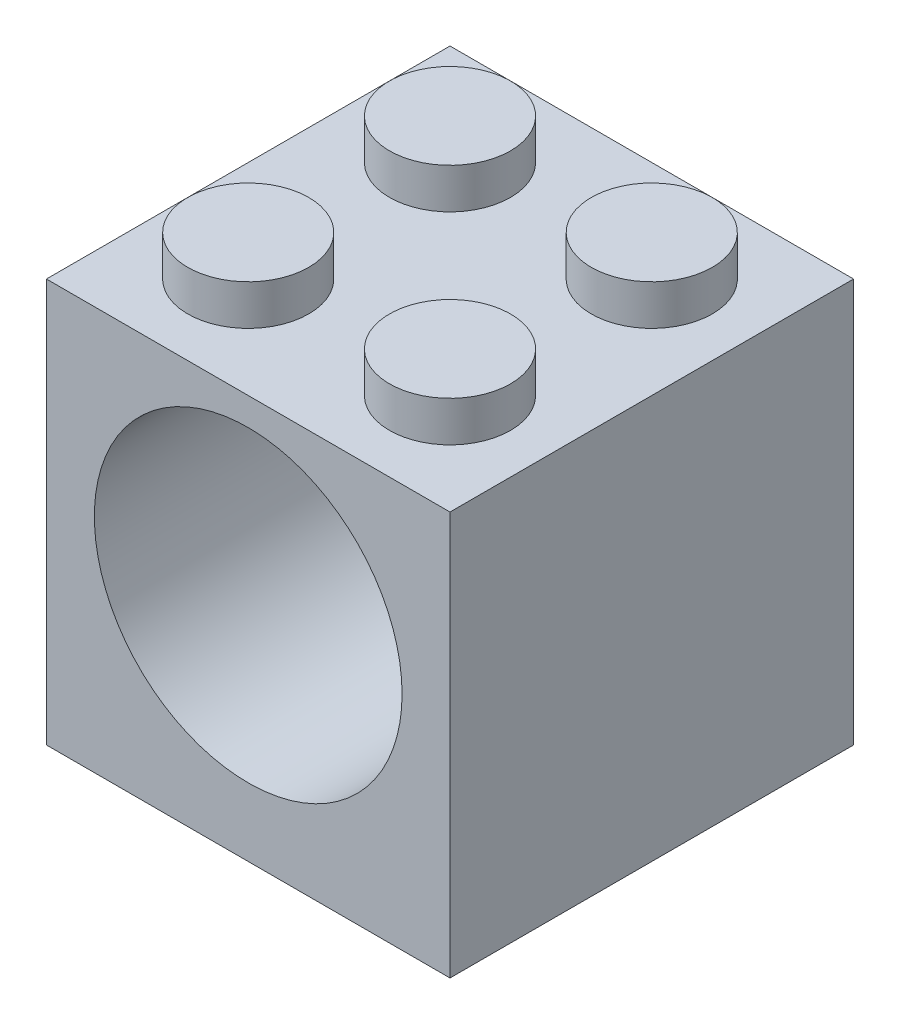
ISO-10303-21;
HEADER;
FILE_DESCRIPTION(('STEP AP214'),'2;1');
FILE_NAME('part.step','',(''),(''),'','','');
FILE_SCHEMA(('AUTOMOTIVE_DESIGN { 1 0 10303 214 1 1 1 1 }'));
ENDSEC;
DATA;
#1=APPLICATION_CONTEXT('core data for automotive mechanical design processes');
#2=APPLICATION_PROTOCOL_DEFINITION('international standard','automotive_design',2000,#1);
#3=PRODUCT_CONTEXT('',#1,'mechanical');
#4=PRODUCT('Part','Part','',(#3));
#5=PRODUCT_RELATED_PRODUCT_CATEGORY('part','',(#4));
#6=PRODUCT_DEFINITION_FORMATION('','',#4);
#7=PRODUCT_DEFINITION_CONTEXT('part definition',#1,'design');
#8=PRODUCT_DEFINITION('design','',#6,#7);
#9=PRODUCT_DEFINITION_SHAPE('','',#8);
#10=(LENGTH_UNIT() NAMED_UNIT(*) SI_UNIT(.MILLI.,.METRE.));
#11=(NAMED_UNIT(*) PLANE_ANGLE_UNIT() SI_UNIT($,.RADIAN.));
#12=(NAMED_UNIT(*) SI_UNIT($,.STERADIAN.) SOLID_ANGLE_UNIT());
#13=UNCERTAINTY_MEASURE_WITH_UNIT(LENGTH_MEASURE(1.E-05),#10,'distance_accuracy_value','');
#14=(GEOMETRIC_REPRESENTATION_CONTEXT(3) GLOBAL_UNCERTAINTY_ASSIGNED_CONTEXT((#13)) GLOBAL_UNIT_ASSIGNED_CONTEXT((#10,
#11,#12)) REPRESENTATION_CONTEXT('',''));
#15=CARTESIAN_POINT('',(0.,0.,0.));
#16=DIRECTION('',(0.,0.,1.));
#17=DIRECTION('',(1.,0.,0.));
#18=AXIS2_PLACEMENT_3D('',#15,#16,#17);
#19=CARTESIAN_POINT('',(12.,4.8,4.));
#20=DIRECTION('',(-1.,0.,0.));
#21=DIRECTION('',(0.,0.,1.));
#22=AXIS2_PLACEMENT_3D('',#19,#20,#21);
#23=PLANE('',#22);
#24=DIRECTION('',(0.,1.,0.));
#25=VECTOR('',#24,1.);
#26=CARTESIAN_POINT('',(12.,4.8,12.));
#27=LINE('',#26,#25);
#28=CARTESIAN_POINT('',(12.,-6.4,12.));
#29=VERTEX_POINT('',#28);
#30=CARTESIAN_POINT('',(12.,9.6,12.));
#31=VERTEX_POINT('',#30);
#32=EDGE_CURVE('E85',#29,#31,#27,.T.);
#33=ORIENTED_EDGE('',*,*,#32,.F.);
#34=DIRECTION('',(0.,0.,1.));
#35=VECTOR('',#34,1.);
#36=CARTESIAN_POINT('',(12.,-6.4,4.));
#37=LINE('',#36,#35);
#38=CARTESIAN_POINT('',(12.,-6.4,-4.));
#39=VERTEX_POINT('',#38);
#40=EDGE_CURVE('E116',#39,#29,#37,.T.);
#41=ORIENTED_EDGE('',*,*,#40,.F.);
#42=DIRECTION('',(0.,-1.,0.));
#43=VECTOR('',#42,1.);
#44=CARTESIAN_POINT('',(12.,4.8,-4.));
#45=LINE('',#44,#43);
#46=CARTESIAN_POINT('',(12.,9.6,-4.));
#47=VERTEX_POINT('',#46);
#48=EDGE_CURVE('E45',#47,#39,#45,.T.);
#49=ORIENTED_EDGE('',*,*,#48,.F.);
#50=DIRECTION('',(0.,0.,-1.));
#51=VECTOR('',#50,1.);
#52=CARTESIAN_POINT('',(12.,9.6,4.));
#53=LINE('',#52,#51);
#54=EDGE_CURVE('E11',#31,#47,#53,.T.);
#55=ORIENTED_EDGE('',*,*,#54,.F.);
#56=EDGE_LOOP('',(#33,#41,#49,#55));
#57=FACE_BOUND('',#56,.T.);
#58=ADVANCED_FACE('F41',(#57),#23,.F.);
#59=CARTESIAN_POINT('',(4.,9.6,4.));
#60=DIRECTION('',(0.,-1.,0.));
#61=DIRECTION('',(0.,0.,-1.));
#62=AXIS2_PLACEMENT_3D('',#59,#60,#61);
#63=PLANE('',#62);
#64=ORIENTED_EDGE('',*,*,#54,.T.);
#65=DIRECTION('',(1.,0.,0.));
#66=VECTOR('',#65,1.);
#67=CARTESIAN_POINT('',(4.,9.6,-4.));
#68=LINE('',#67,#66);
#69=CARTESIAN_POINT('',(-4.,9.6,-4.));
#70=VERTEX_POINT('',#69);
#71=EDGE_CURVE('E121',#70,#47,#68,.T.);
#72=ORIENTED_EDGE('',*,*,#71,.F.);
#73=DIRECTION('',(0.,0.,-1.));
#74=VECTOR('',#73,1.);
#75=CARTESIAN_POINT('',(-4.,9.6,4.));
#76=LINE('',#75,#74);
#77=CARTESIAN_POINT('',(-4.,9.6,12.));
#78=VERTEX_POINT('',#77);
#79=EDGE_CURVE('E51',#78,#70,#76,.T.);
#80=ORIENTED_EDGE('',*,*,#79,.F.);
#81=DIRECTION('',(-1.,0.,0.));
#82=VECTOR('',#81,1.);
#83=CARTESIAN_POINT('',(4.,9.6,12.));
#84=LINE('',#83,#82);
#85=EDGE_CURVE('E100',#31,#78,#84,.T.);
#86=ORIENTED_EDGE('',*,*,#85,.F.);
#87=EDGE_LOOP('',(#64,#72,#80,#86));
#88=FACE_BOUND('',#87,.T.);
#89=CARTESIAN_POINT('',(0.,9.6,0.));
#90=DIRECTION('',(0.,-1.,0.));
#91=DIRECTION('',(1.,0.,0.));
#92=AXIS2_PLACEMENT_3D('',#89,#90,#91);
#93=CIRCLE('',#92,2.4);
#94=CARTESIAN_POINT('',(2.4,9.6,0.));
#95=VERTEX_POINT('',#94);
#96=EDGE_CURVE('E110',#95,#95,#93,.T.);
#97=ORIENTED_EDGE('',*,*,#96,.T.);
#98=EDGE_LOOP('',(#97));
#99=FACE_BOUND('',#98,.T.);
#100=CARTESIAN_POINT('',(0.,9.6,8.));
#101=DIRECTION('',(0.,-1.,0.));
#102=DIRECTION('',(1.,0.,0.));
#103=AXIS2_PLACEMENT_3D('',#100,#101,#102);
#104=CIRCLE('',#103,2.4);
#105=CARTESIAN_POINT('',(2.4,9.6,8.));
#106=VERTEX_POINT('',#105);
#107=EDGE_CURVE('E123',#106,#106,#104,.T.);
#108=ORIENTED_EDGE('',*,*,#107,.T.);
#109=EDGE_LOOP('',(#108));
#110=FACE_BOUND('',#109,.T.);
#111=CARTESIAN_POINT('',(8.,9.6,0.));
#112=DIRECTION('',(0.,-1.,0.));
#113=DIRECTION('',(1.,0.,0.));
#114=AXIS2_PLACEMENT_3D('',#111,#112,#113);
#115=CIRCLE('',#114,2.4);
#116=CARTESIAN_POINT('',(10.4,9.6,0.));
#117=VERTEX_POINT('',#116);
#118=EDGE_CURVE('E126',#117,#117,#115,.T.);
#119=ORIENTED_EDGE('',*,*,#118,.T.);
#120=EDGE_LOOP('',(#119));
#121=FACE_BOUND('',#120,.T.);
#122=CARTESIAN_POINT('',(8.,9.6,8.));
#123=DIRECTION('',(0.,-1.,0.));
#124=DIRECTION('',(1.,0.,0.));
#125=AXIS2_PLACEMENT_3D('',#122,#123,#124);
#126=CIRCLE('',#125,2.4);
#127=CARTESIAN_POINT('',(10.4,9.6,8.));
#128=VERTEX_POINT('',#127);
#129=EDGE_CURVE('E127',#128,#128,#126,.T.);
#130=ORIENTED_EDGE('',*,*,#129,.T.);
#131=EDGE_LOOP('',(#130));
#132=FACE_BOUND('',#131,.T.);
#133=ADVANCED_FACE('F101',(#88,#99,#110,#121,#132),#63,.F.);
#134=CARTESIAN_POINT('',(-4.,4.8,4.));
#135=DIRECTION('',(1.,0.,0.));
#136=DIRECTION('',(0.,0.,-1.));
#137=AXIS2_PLACEMENT_3D('',#134,#135,#136);
#138=PLANE('',#137);
#139=ORIENTED_EDGE('',*,*,#79,.T.);
#140=DIRECTION('',(0.,1.,0.));
#141=VECTOR('',#140,1.);
#142=CARTESIAN_POINT('',(-4.,4.8,-4.));
#143=LINE('',#142,#141);
#144=CARTESIAN_POINT('',(-4.,-6.4,-4.));
#145=VERTEX_POINT('',#144);
#146=EDGE_CURVE('E118',#145,#70,#143,.T.);
#147=ORIENTED_EDGE('',*,*,#146,.F.);
#148=DIRECTION('',(0.,0.,-1.));
#149=VECTOR('',#148,1.);
#150=CARTESIAN_POINT('',(-4.,-6.4,4.));
#151=LINE('',#150,#149);
#152=CARTESIAN_POINT('',(-4.,-6.4,12.));
#153=VERTEX_POINT('',#152);
#154=EDGE_CURVE('E148',#153,#145,#151,.T.);
#155=ORIENTED_EDGE('',*,*,#154,.F.);
#156=DIRECTION('',(0.,-1.,0.));
#157=VECTOR('',#156,1.);
#158=CARTESIAN_POINT('',(-4.,4.8,12.));
#159=LINE('',#158,#157);
#160=EDGE_CURVE('E105',#78,#153,#159,.T.);
#161=ORIENTED_EDGE('',*,*,#160,.F.);
#162=EDGE_LOOP('',(#139,#147,#155,#161));
#163=FACE_BOUND('',#162,.T.);
#164=ADVANCED_FACE('F173',(#163),#138,.F.);
#165=CARTESIAN_POINT('',(4.,4.8,-4.));
#166=DIRECTION('',(0.,0.,1.));
#167=DIRECTION('',(1.,0.,0.));
#168=AXIS2_PLACEMENT_3D('',#165,#166,#167);
#169=PLANE('',#168);
#170=CARTESIAN_POINT('',(4.,2.4,-4.));
#171=DIRECTION('',(0.,0.,1.));
#172=DIRECTION('',(1.,0.,0.));
#173=AXIS2_PLACEMENT_3D('',#170,#171,#172);
#174=CIRCLE('',#173,6.1);
#175=CARTESIAN_POINT('',(10.1,2.4,-4.));
#176=VERTEX_POINT('',#175);
#177=EDGE_CURVE('E152',#176,#176,#174,.T.);
#178=ORIENTED_EDGE('',*,*,#177,.T.);
#179=EDGE_LOOP('',(#178));
#180=FACE_BOUND('',#179,.T.);
#181=ORIENTED_EDGE('',*,*,#48,.T.);
#182=DIRECTION('',(1.,0.,0.));
#183=VECTOR('',#182,1.);
#184=CARTESIAN_POINT('',(4.,-6.4,-4.));
#185=LINE('',#184,#183);
#186=EDGE_CURVE('E144',#145,#39,#185,.T.);
#187=ORIENTED_EDGE('',*,*,#186,.F.);
#188=ORIENTED_EDGE('',*,*,#146,.T.);
#189=ORIENTED_EDGE('',*,*,#71,.T.);
#190=EDGE_LOOP('',(#181,#187,#188,#189));
#191=FACE_BOUND('',#190,.T.);
#192=ADVANCED_FACE('F143',(#180,#191),#169,.F.);
#193=CARTESIAN_POINT('',(4.,4.8,12.));
#194=DIRECTION('',(0.,0.,1.));
#195=DIRECTION('',(1.,0.,0.));
#196=AXIS2_PLACEMENT_3D('',#193,#194,#195);
#197=PLANE('',#196);
#198=CARTESIAN_POINT('',(4.,2.4,12.));
#199=DIRECTION('',(0.,0.,1.));
#200=DIRECTION('',(1.,0.,0.));
#201=AXIS2_PLACEMENT_3D('',#198,#199,#200);
#202=CIRCLE('',#201,6.1);
#203=CARTESIAN_POINT('',(10.1,2.4,12.));
#204=VERTEX_POINT('',#203);
#205=EDGE_CURVE('E153',#204,#204,#202,.T.);
#206=ORIENTED_EDGE('',*,*,#205,.F.);
#207=EDGE_LOOP('',(#206));
#208=FACE_BOUND('',#207,.T.);
#209=ORIENTED_EDGE('',*,*,#32,.T.);
#210=ORIENTED_EDGE('',*,*,#85,.T.);
#211=ORIENTED_EDGE('',*,*,#160,.T.);
#212=DIRECTION('',(-1.,0.,0.));
#213=VECTOR('',#212,1.);
#214=CARTESIAN_POINT('',(4.,-6.4,12.));
#215=LINE('',#214,#213);
#216=EDGE_CURVE('E109',#29,#153,#215,.T.);
#217=ORIENTED_EDGE('',*,*,#216,.F.);
#218=EDGE_LOOP('',(#209,#210,#211,#217));
#219=FACE_BOUND('',#218,.T.);
#220=ADVANCED_FACE('F43',(#208,#219),#197,.T.);
#221=CARTESIAN_POINT('',(0.,11.2,0.));
#222=DIRECTION('',(0.,1.,0.));
#223=DIRECTION('',(1.,0.,0.));
#224=AXIS2_PLACEMENT_3D('',#221,#222,#223);
#225=PLANE('',#224);
#226=CARTESIAN_POINT('',(0.,11.2,0.));
#227=DIRECTION('',(0.,1.,0.));
#228=DIRECTION('',(1.,0.,0.));
#229=AXIS2_PLACEMENT_3D('',#226,#227,#228);
#230=CIRCLE('',#229,2.4);
#231=CARTESIAN_POINT('',(2.4,11.2,0.));
#232=VERTEX_POINT('',#231);
#233=EDGE_CURVE('E94',#232,#232,#230,.T.);
#234=ORIENTED_EDGE('',*,*,#233,.T.);
#235=EDGE_LOOP('',(#234));
#236=FACE_BOUND('',#235,.T.);
#237=ADVANCED_FACE('F167',(#236),#225,.T.);
#238=CARTESIAN_POINT('',(0.,10.15,0.));
#239=DIRECTION('',(0.,-1.,0.));
#240=DIRECTION('',(1.,0.,0.));
#241=AXIS2_PLACEMENT_3D('',#238,#239,#240);
#242=CYLINDRICAL_SURFACE('',#241,2.4);
#243=ORIENTED_EDGE('',*,*,#96,.F.);
#244=EDGE_LOOP('',(#243));
#245=FACE_BOUND('',#244,.T.);
#246=ORIENTED_EDGE('',*,*,#233,.F.);
#247=EDGE_LOOP('',(#246));
#248=FACE_BOUND('',#247,.T.);
#249=ADVANCED_FACE('F172',(#245,#248),#242,.T.);
#250=CARTESIAN_POINT('',(0.,11.2,8.));
#251=DIRECTION('',(0.,1.,0.));
#252=DIRECTION('',(1.,0.,0.));
#253=AXIS2_PLACEMENT_3D('',#250,#251,#252);
#254=PLANE('',#253);
#255=CARTESIAN_POINT('',(0.,11.2,8.));
#256=DIRECTION('',(0.,1.,0.));
#257=DIRECTION('',(1.,0.,0.));
#258=AXIS2_PLACEMENT_3D('',#255,#256,#257);
#259=CIRCLE('',#258,2.4);
#260=CARTESIAN_POINT('',(2.4,11.2,8.));
#261=VERTEX_POINT('',#260);
#262=EDGE_CURVE('E132',#261,#261,#259,.T.);
#263=ORIENTED_EDGE('',*,*,#262,.T.);
#264=EDGE_LOOP('',(#263));
#265=FACE_BOUND('',#264,.T.);
#266=ADVANCED_FACE('F202',(#265),#254,.T.);
#267=CARTESIAN_POINT('',(0.,10.15,8.));
#268=DIRECTION('',(0.,-1.,0.));
#269=DIRECTION('',(1.,0.,0.));
#270=AXIS2_PLACEMENT_3D('',#267,#268,#269);
#271=CYLINDRICAL_SURFACE('',#270,2.4);
#272=ORIENTED_EDGE('',*,*,#107,.F.);
#273=EDGE_LOOP('',(#272));
#274=FACE_BOUND('',#273,.T.);
#275=ORIENTED_EDGE('',*,*,#262,.F.);
#276=EDGE_LOOP('',(#275));
#277=FACE_BOUND('',#276,.T.);
#278=ADVANCED_FACE('F195',(#274,#277),#271,.T.);
#279=CARTESIAN_POINT('',(8.,11.2,0.));
#280=DIRECTION('',(0.,1.,0.));
#281=DIRECTION('',(1.,0.,0.));
#282=AXIS2_PLACEMENT_3D('',#279,#280,#281);
#283=PLANE('',#282);
#284=CARTESIAN_POINT('',(8.,11.2,0.));
#285=DIRECTION('',(0.,1.,0.));
#286=DIRECTION('',(1.,0.,0.));
#287=AXIS2_PLACEMENT_3D('',#284,#285,#286);
#288=CIRCLE('',#287,2.4);
#289=CARTESIAN_POINT('',(10.4,11.2,0.));
#290=VERTEX_POINT('',#289);
#291=EDGE_CURVE('E124',#290,#290,#288,.T.);
#292=ORIENTED_EDGE('',*,*,#291,.T.);
#293=EDGE_LOOP('',(#292));
#294=FACE_BOUND('',#293,.T.);
#295=ADVANCED_FACE('F188',(#294),#283,.T.);
#296=CARTESIAN_POINT('',(8.,10.15,0.));
#297=DIRECTION('',(0.,-1.,0.));
#298=DIRECTION('',(1.,0.,0.));
#299=AXIS2_PLACEMENT_3D('',#296,#297,#298);
#300=CYLINDRICAL_SURFACE('',#299,2.4);
#301=ORIENTED_EDGE('',*,*,#118,.F.);
#302=EDGE_LOOP('',(#301));
#303=FACE_BOUND('',#302,.T.);
#304=ORIENTED_EDGE('',*,*,#291,.F.);
#305=EDGE_LOOP('',(#304));
#306=FACE_BOUND('',#305,.T.);
#307=ADVANCED_FACE('F184',(#303,#306),#300,.T.);
#308=CARTESIAN_POINT('',(8.,11.2,8.));
#309=DIRECTION('',(0.,1.,0.));
#310=DIRECTION('',(1.,0.,0.));
#311=AXIS2_PLACEMENT_3D('',#308,#309,#310);
#312=PLANE('',#311);
#313=CARTESIAN_POINT('',(8.,11.2,8.));
#314=DIRECTION('',(0.,1.,0.));
#315=DIRECTION('',(1.,0.,0.));
#316=AXIS2_PLACEMENT_3D('',#313,#314,#315);
#317=CIRCLE('',#316,2.4);
#318=CARTESIAN_POINT('',(10.4,11.2,8.));
#319=VERTEX_POINT('',#318);
#320=EDGE_CURVE('E76',#319,#319,#317,.T.);
#321=ORIENTED_EDGE('',*,*,#320,.T.);
#322=EDGE_LOOP('',(#321));
#323=FACE_BOUND('',#322,.T.);
#324=ADVANCED_FACE('F187',(#323),#312,.T.);
#325=CARTESIAN_POINT('',(8.,10.15,8.));
#326=DIRECTION('',(0.,-1.,0.));
#327=DIRECTION('',(1.,0.,0.));
#328=AXIS2_PLACEMENT_3D('',#325,#326,#327);
#329=CYLINDRICAL_SURFACE('',#328,2.4);
#330=ORIENTED_EDGE('',*,*,#129,.F.);
#331=EDGE_LOOP('',(#330));
#332=FACE_BOUND('',#331,.T.);
#333=ORIENTED_EDGE('',*,*,#320,.F.);
#334=EDGE_LOOP('',(#333));
#335=FACE_BOUND('',#334,.T.);
#336=ADVANCED_FACE('F190',(#332,#335),#329,.T.);
#337=CARTESIAN_POINT('',(0.,-6.4,0.));
#338=DIRECTION('',(0.,-1.,0.));
#339=DIRECTION('',(0.,0.,-1.));
#340=AXIS2_PLACEMENT_3D('',#337,#338,#339);
#341=PLANE('',#340);
#342=ORIENTED_EDGE('',*,*,#216,.T.);
#343=ORIENTED_EDGE('',*,*,#154,.T.);
#344=ORIENTED_EDGE('',*,*,#186,.T.);
#345=ORIENTED_EDGE('',*,*,#40,.T.);
#346=EDGE_LOOP('',(#342,#343,#344,#345));
#347=FACE_BOUND('',#346,.T.);
#348=ADVANCED_FACE('F147',(#347),#341,.T.);
#349=CARTESIAN_POINT('',(4.,2.4,-4.));
#350=DIRECTION('',(0.,0.,1.));
#351=DIRECTION('',(1.,0.,0.));
#352=AXIS2_PLACEMENT_3D('',#349,#350,#351);
#353=CYLINDRICAL_SURFACE('',#352,6.1);
#354=ORIENTED_EDGE('',*,*,#177,.F.);
#355=EDGE_LOOP('',(#354));
#356=FACE_BOUND('',#355,.T.);
#357=ORIENTED_EDGE('',*,*,#205,.T.);
#358=EDGE_LOOP('',(#357));
#359=FACE_BOUND('',#358,.T.);
#360=ADVANCED_FACE('F160',(#356,#359),#353,.F.);
#361=CLOSED_SHELL('',(#58,#133,#164,#192,#220,#237,#249,#266,#278,#295,#307,#324,#336,#348,#360));
#362=MANIFOLD_SOLID_BREP('B2',#361);
#363=ADVANCED_BREP_SHAPE_REPRESENTATION('',(#18,#362),#14);
#364=SHAPE_DEFINITION_REPRESENTATION(#9,#363);
ENDSEC;
END-ISO-10303-21;
